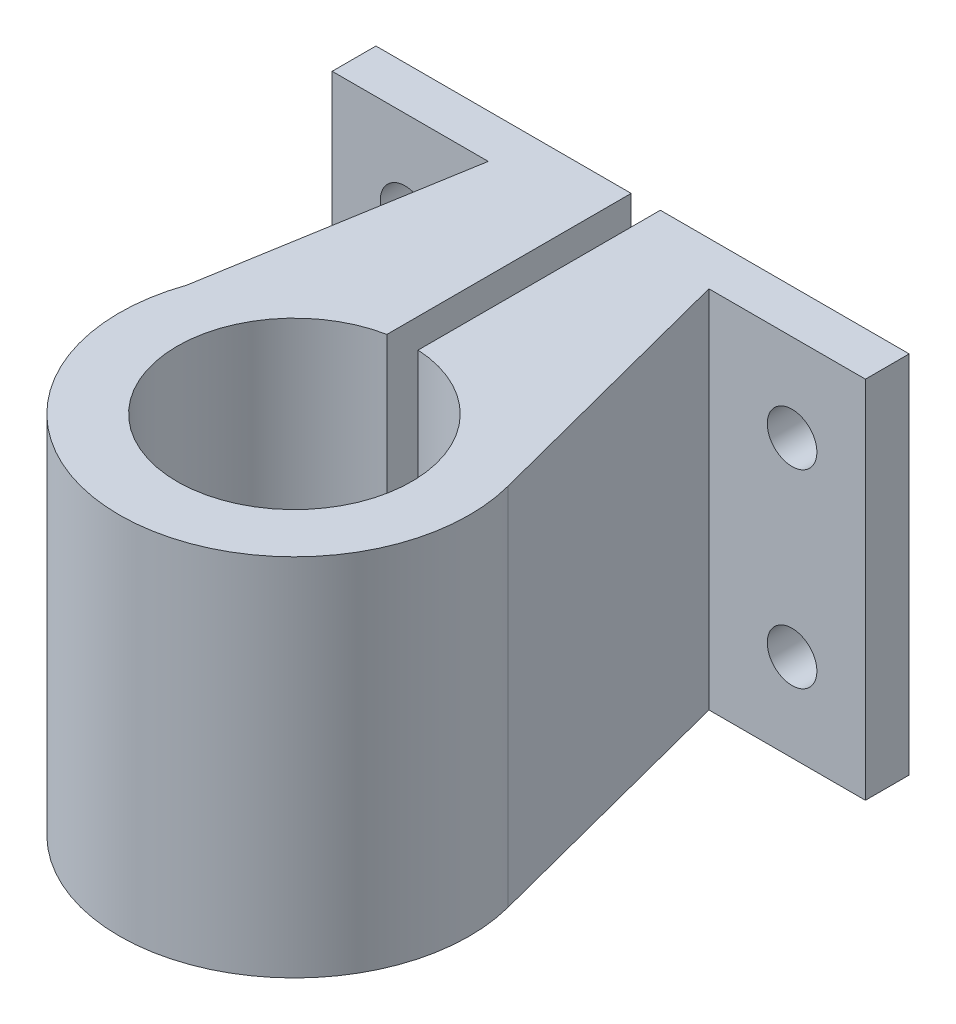
ISO-10303-21;
HEADER;
FILE_DESCRIPTION(('STEP AP214'),'2;1');
FILE_NAME('part.step','',(''),(''),'','','');
FILE_SCHEMA(('AUTOMOTIVE_DESIGN { 1 0 10303 214 1 1 1 1 }'));
ENDSEC;
DATA;
#1=APPLICATION_CONTEXT('core data for automotive mechanical design processes');
#2=APPLICATION_PROTOCOL_DEFINITION('international standard','automotive_design',2000,#1);
#3=PRODUCT_CONTEXT('',#1,'mechanical');
#4=PRODUCT('Part','Part','',(#3));
#5=PRODUCT_RELATED_PRODUCT_CATEGORY('part','',(#4));
#6=PRODUCT_DEFINITION_FORMATION('','',#4);
#7=PRODUCT_DEFINITION_CONTEXT('part definition',#1,'design');
#8=PRODUCT_DEFINITION('design','',#6,#7);
#9=PRODUCT_DEFINITION_SHAPE('','',#8);
#10=(LENGTH_UNIT() NAMED_UNIT(*) SI_UNIT(.MILLI.,.METRE.));
#11=(NAMED_UNIT(*) PLANE_ANGLE_UNIT() SI_UNIT($,.RADIAN.));
#12=(NAMED_UNIT(*) SI_UNIT($,.STERADIAN.) SOLID_ANGLE_UNIT());
#13=UNCERTAINTY_MEASURE_WITH_UNIT(LENGTH_MEASURE(1.E-05),#10,'distance_accuracy_value','');
#14=(GEOMETRIC_REPRESENTATION_CONTEXT(3) GLOBAL_UNCERTAINTY_ASSIGNED_CONTEXT((#13)) GLOBAL_UNIT_ASSIGNED_CONTEXT((#10,
#11,#12)) REPRESENTATION_CONTEXT('',''));
#15=CARTESIAN_POINT('',(0.,0.,0.));
#16=DIRECTION('',(0.,0.,1.));
#17=DIRECTION('',(1.,0.,0.));
#18=AXIS2_PLACEMENT_3D('',#15,#16,#17);
#19=CARTESIAN_POINT('',(-194.02376616138,0.,38.));
#20=DIRECTION('',(1.,0.,0.));
#21=DIRECTION('',(0.,0.,-1.));
#22=AXIS2_PLACEMENT_3D('',#19,#20,#21);
#23=PLANE('',#22);
#24=DIRECTION('',(0.,0.,-1.));
#25=VECTOR('',#24,1.);
#26=CARTESIAN_POINT('',(-194.02376616138,235.923622409626,38.));
#27=LINE('',#26,#25);
#28=CARTESIAN_POINT('',(-194.02376616138,235.923622409626,2.9999999999329));
#29=VERTEX_POINT('',#28);
#30=CARTESIAN_POINT('',(-194.02376616138,235.923622409626,0.));
#31=VERTEX_POINT('',#30);
#32=EDGE_CURVE('E208',#29,#31,#27,.T.);
#33=ORIENTED_EDGE('',*,*,#32,.F.);
#34=DIRECTION('',(0.,1.,0.));
#35=VECTOR('',#34,1.);
#36=CARTESIAN_POINT('',(-194.02376616138,197.923622409626,2.9999999999329));
#37=LINE('',#36,#35);
#38=CARTESIAN_POINT('',(-194.02376616138,210.923622409626,2.9999999999329));
#39=VERTEX_POINT('',#38);
#40=EDGE_CURVE('E259',#39,#29,#37,.T.);
#41=ORIENTED_EDGE('',*,*,#40,.F.);
#42=DIRECTION('',(0.,0.,-1.));
#43=VECTOR('',#42,1.);
#44=CARTESIAN_POINT('',(-194.02376616138,210.923622409626,38.));
#45=LINE('',#44,#43);
#46=CARTESIAN_POINT('',(-194.02376616138,210.923622409626,0.));
#47=VERTEX_POINT('',#46);
#48=EDGE_CURVE('E202',#39,#47,#45,.T.);
#49=ORIENTED_EDGE('',*,*,#48,.T.);
#50=DIRECTION('',(0.,-1.,0.));
#51=VECTOR('',#50,1.);
#52=CARTESIAN_POINT('',(-194.02376616138,0.,0.));
#53=LINE('',#52,#51);
#54=EDGE_CURVE('E196',#31,#47,#53,.T.);
#55=ORIENTED_EDGE('',*,*,#54,.F.);
#56=EDGE_LOOP('',(#33,#41,#49,#55));
#57=FACE_BOUND('',#56,.T.);
#58=ADVANCED_FACE('F72',(#57),#23,.T.);
#59=CARTESIAN_POINT('',(0.,235.923622409626,38.));
#60=DIRECTION('',(0.,1.,0.));
#61=DIRECTION('',(0.,0.,1.));
#62=AXIS2_PLACEMENT_3D('',#59,#60,#61);
#63=PLANE('',#62);
#64=CARTESIAN_POINT('',(-211.531114438714,235.923622409626,24.6300000000886));
#65=DIRECTION('',(0.,1.,0.));
#66=DIRECTION('',(0.,0.,1.));
#67=AXIS2_PLACEMENT_3D('',#64,#65,#66);
#68=CIRCLE('',#67,8.03826441037711);
#69=CARTESIAN_POINT('',(-213.078407845974,235.923622409626,16.7420612425307));
#70=VERTEX_POINT('',#69);
#71=CARTESIAN_POINT('',(-211.078407845971,235.923622409626,16.6044936938159));
#72=VERTEX_POINT('',#71);
#73=EDGE_CURVE('E184',#70,#72,#68,.T.);
#74=ORIENTED_EDGE('',*,*,#73,.F.);
#75=DIRECTION('',(1.06101441971057E-13,0.,-1.));
#76=VECTOR('',#75,1.);
#77=CARTESIAN_POINT('',(-213.078407845972,235.923622409626,-2.26079263253546E-11));
#78=LINE('',#77,#76);
#79=CARTESIAN_POINT('',(-213.078407845973,235.923622409626,0.));
#80=VERTEX_POINT('',#79);
#81=EDGE_CURVE('E167',#70,#80,#78,.T.);
#82=ORIENTED_EDGE('',*,*,#81,.T.);
#83=DIRECTION('',(1.,0.,0.));
#84=VECTOR('',#83,1.);
#85=CARTESIAN_POINT('',(0.,235.923622409626,0.));
#86=LINE('',#85,#84);
#87=CARTESIAN_POINT('',(-230.573766162715,235.923622409626,0.));
#88=VERTEX_POINT('',#87);
#89=EDGE_CURVE('E182',#88,#80,#86,.T.);
#90=ORIENTED_EDGE('',*,*,#89,.F.);
#91=DIRECTION('',(0.,0.,-1.));
#92=VECTOR('',#91,1.);
#93=CARTESIAN_POINT('',(-230.573766162715,235.923622409626,38.));
#94=LINE('',#93,#92);
#95=CARTESIAN_POINT('',(-230.573766162715,235.923622409626,3.));
#96=VERTEX_POINT('',#95);
#97=EDGE_CURVE('E206',#96,#88,#94,.T.);
#98=ORIENTED_EDGE('',*,*,#97,.F.);
#99=DIRECTION('',(1.,0.,0.));
#100=VECTOR('',#99,1.);
#101=CARTESIAN_POINT('',(0.,235.923622409626,3.));
#102=LINE('',#101,#100);
#103=CARTESIAN_POINT('',(-219.873766162724,235.923622409626,3.));
#104=VERTEX_POINT('',#103);
#105=EDGE_CURVE('E244',#96,#104,#102,.T.);
#106=ORIENTED_EDGE('',*,*,#105,.T.);
#107=DIRECTION('',(-0.166720335133998,0.,0.986004224054242));
#108=VECTOR('',#107,1.);
#109=CARTESIAN_POINT('',(-213.269066620411,235.923622409626,-36.0609918226008));
#110=LINE('',#109,#108);
#111=CARTESIAN_POINT('',(-222.864018355181,235.923622409626,20.6847130878201));
#112=VERTEX_POINT('',#111);
#113=EDGE_CURVE('E241',#104,#112,#110,.T.);
#114=ORIENTED_EDGE('',*,*,#113,.T.);
#115=CARTESIAN_POINT('',(-211.531114438714,235.923622409626,24.6300000000886));
#116=DIRECTION('',(0.,1.,0.));
#117=DIRECTION('',(0.,0.,1.));
#118=AXIS2_PLACEMENT_3D('',#115,#116,#117);
#119=CIRCLE('',#118,12.);
#120=CARTESIAN_POINT('',(-199.916412955826,235.923622409626,21.6135932862324));
#121=VERTEX_POINT('',#120);
#122=EDGE_CURVE('E185',#112,#121,#119,.T.);
#123=ORIENTED_EDGE('',*,*,#122,.T.);
#124=DIRECTION('',(0.251367226154686,0.,0.967891790240675));
#125=VECTOR('',#124,1.);
#126=CARTESIAN_POINT('',(-192.543104692355,235.923622409626,50.0045838075491));
#127=LINE('',#126,#125);
#128=CARTESIAN_POINT('',(-204.750473292245,235.923622409626,2.9999999999329));
#129=VERTEX_POINT('',#128);
#130=EDGE_CURVE('E250',#129,#121,#127,.T.);
#131=ORIENTED_EDGE('',*,*,#130,.F.);
#132=DIRECTION('',(1.,0.,0.));
#133=VECTOR('',#132,1.);
#134=CARTESIAN_POINT('',(0.,235.923622409626,2.9999999999329));
#135=LINE('',#134,#133);
#136=EDGE_CURVE('E247',#129,#29,#135,.T.);
#137=ORIENTED_EDGE('',*,*,#136,.T.);
#138=ORIENTED_EDGE('',*,*,#32,.T.);
#139=CARTESIAN_POINT('',(-211.078407845972,235.923622409626,0.));
#140=VERTEX_POINT('',#139);
#141=EDGE_CURVE('E191',#140,#31,#86,.T.);
#142=ORIENTED_EDGE('',*,*,#141,.F.);
#143=DIRECTION('',(0.,0.,-1.));
#144=VECTOR('',#143,1.);
#145=CARTESIAN_POINT('',(-211.078407845972,235.923622409626,6.70381485510578E-12));
#146=LINE('',#145,#144);
#147=EDGE_CURVE('E97',#72,#140,#146,.T.);
#148=ORIENTED_EDGE('',*,*,#147,.F.);
#149=EDGE_LOOP('',(#74,#82,#90,#98,#106,#114,#123,#131,#137,#138,#142,#148));
#150=FACE_BOUND('',#149,.T.);
#151=ADVANCED_FACE('F180',(#150),#63,.T.);
#152=CARTESIAN_POINT('',(-230.573766162715,0.,38.));
#153=DIRECTION('',(1.,0.,0.));
#154=DIRECTION('',(0.,0.,-1.));
#155=AXIS2_PLACEMENT_3D('',#152,#153,#154);
#156=PLANE('',#155);
#157=DIRECTION('',(0.,1.,0.));
#158=VECTOR('',#157,1.);
#159=CARTESIAN_POINT('',(-230.573766162715,197.923622409626,3.));
#160=LINE('',#159,#158);
#161=CARTESIAN_POINT('',(-230.573766162715,210.923622409626,3.));
#162=VERTEX_POINT('',#161);
#163=EDGE_CURVE('E261',#162,#96,#160,.T.);
#164=ORIENTED_EDGE('',*,*,#163,.T.);
#165=ORIENTED_EDGE('',*,*,#97,.T.);
#166=DIRECTION('',(0.,-1.,0.));
#167=VECTOR('',#166,1.);
#168=CARTESIAN_POINT('',(-230.573766162715,0.,0.));
#169=LINE('',#168,#167);
#170=CARTESIAN_POINT('',(-230.573766162715,210.923622409626,0.));
#171=VERTEX_POINT('',#170);
#172=EDGE_CURVE('E190',#88,#171,#169,.T.);
#173=ORIENTED_EDGE('',*,*,#172,.T.);
#174=DIRECTION('',(0.,0.,-1.));
#175=VECTOR('',#174,1.);
#176=CARTESIAN_POINT('',(-230.573766162715,210.923622409626,38.));
#177=LINE('',#176,#175);
#178=EDGE_CURVE('E204',#162,#171,#177,.T.);
#179=ORIENTED_EDGE('',*,*,#178,.F.);
#180=EDGE_LOOP('',(#164,#165,#173,#179));
#181=FACE_BOUND('',#180,.T.);
#182=ADVANCED_FACE('F318',(#181),#156,.F.);
#183=CARTESIAN_POINT('',(-225.573766162715,216.923622409632,38.));
#184=DIRECTION('',(0.,0.,-1.));
#185=DIRECTION('',(-1.,0.,0.));
#186=AXIS2_PLACEMENT_3D('',#183,#184,#185);
#187=CYLINDRICAL_SURFACE('',#186,1.69999999999999);
#188=CARTESIAN_POINT('',(-225.573766162715,216.923622409632,0.));
#189=DIRECTION('',(0.,0.,1.));
#190=DIRECTION('',(1.,0.,0.));
#191=AXIS2_PLACEMENT_3D('',#188,#189,#190);
#192=CIRCLE('',#191,1.69999999999999);
#193=CARTESIAN_POINT('',(-223.873766162715,216.923622409632,0.));
#194=VERTEX_POINT('',#193);
#195=EDGE_CURVE('E277',#194,#194,#192,.T.);
#196=ORIENTED_EDGE('',*,*,#195,.F.);
#197=EDGE_LOOP('',(#196));
#198=FACE_BOUND('',#197,.T.);
#199=CARTESIAN_POINT('',(-225.573766162715,216.923622409632,3.));
#200=DIRECTION('',(0.,0.,1.));
#201=DIRECTION('',(1.,0.,0.));
#202=AXIS2_PLACEMENT_3D('',#199,#200,#201);
#203=CIRCLE('',#202,1.69999999999999);
#204=CARTESIAN_POINT('',(-223.873766162715,216.923622409632,3.));
#205=VERTEX_POINT('',#204);
#206=EDGE_CURVE('E272',#205,#205,#203,.T.);
#207=ORIENTED_EDGE('',*,*,#206,.T.);
#208=EDGE_LOOP('',(#207));
#209=FACE_BOUND('',#208,.T.);
#210=ADVANCED_FACE('F340',(#198,#209),#187,.F.);
#211=CARTESIAN_POINT('',(-225.573766162715,229.923622409632,38.));
#212=DIRECTION('',(0.,0.,-1.));
#213=DIRECTION('',(-1.,0.,0.));
#214=AXIS2_PLACEMENT_3D('',#211,#212,#213);
#215=CYLINDRICAL_SURFACE('',#214,1.69999999999999);
#216=CARTESIAN_POINT('',(-225.573766162715,229.923622409632,0.));
#217=DIRECTION('',(0.,0.,1.));
#218=DIRECTION('',(1.,0.,0.));
#219=AXIS2_PLACEMENT_3D('',#216,#217,#218);
#220=CIRCLE('',#219,1.69999999999999);
#221=CARTESIAN_POINT('',(-223.873766162715,229.923622409632,0.));
#222=VERTEX_POINT('',#221);
#223=EDGE_CURVE('E275',#222,#222,#220,.T.);
#224=ORIENTED_EDGE('',*,*,#223,.F.);
#225=EDGE_LOOP('',(#224));
#226=FACE_BOUND('',#225,.T.);
#227=CARTESIAN_POINT('',(-225.573766162715,229.923622409632,3.));
#228=DIRECTION('',(0.,0.,1.));
#229=DIRECTION('',(1.,0.,0.));
#230=AXIS2_PLACEMENT_3D('',#227,#228,#229);
#231=CIRCLE('',#230,1.69999999999999);
#232=CARTESIAN_POINT('',(-223.873766162715,229.923622409632,3.));
#233=VERTEX_POINT('',#232);
#234=EDGE_CURVE('E269',#233,#233,#231,.T.);
#235=ORIENTED_EDGE('',*,*,#234,.T.);
#236=EDGE_LOOP('',(#235));
#237=FACE_BOUND('',#236,.T.);
#238=ADVANCED_FACE('F74',(#226,#237),#215,.F.);
#239=CARTESIAN_POINT('',(0.,210.923622409626,38.));
#240=DIRECTION('',(0.,1.,0.));
#241=DIRECTION('',(0.,0.,1.));
#242=AXIS2_PLACEMENT_3D('',#239,#240,#241);
#243=PLANE('',#242);
#244=DIRECTION('',(1.06101441971057E-13,0.,-1.));
#245=VECTOR('',#244,1.);
#246=CARTESIAN_POINT('',(-213.078407845976,210.923622409626,37.9999999999774));
#247=LINE('',#246,#245);
#248=CARTESIAN_POINT('',(-213.078407845974,210.923622409626,16.7420612425307));
#249=VERTEX_POINT('',#248);
#250=CARTESIAN_POINT('',(-213.078407845973,210.923622409626,0.));
#251=VERTEX_POINT('',#250);
#252=EDGE_CURVE('E170',#249,#251,#247,.T.);
#253=ORIENTED_EDGE('',*,*,#252,.F.);
#254=CARTESIAN_POINT('',(-211.531114438714,210.923622409626,24.6300000000886));
#255=DIRECTION('',(0.,1.,0.));
#256=DIRECTION('',(0.,0.,1.));
#257=AXIS2_PLACEMENT_3D('',#254,#255,#256);
#258=CIRCLE('',#257,8.03826441037711);
#259=CARTESIAN_POINT('',(-211.078407845971,210.923622409626,16.6044936938159));
#260=VERTEX_POINT('',#259);
#261=EDGE_CURVE('E12',#249,#260,#258,.T.);
#262=ORIENTED_EDGE('',*,*,#261,.T.);
#263=DIRECTION('',(0.,0.,-1.));
#264=VECTOR('',#263,1.);
#265=CARTESIAN_POINT('',(-211.078407845971,210.923622409626,38.0000000000067));
#266=LINE('',#265,#264);
#267=CARTESIAN_POINT('',(-211.078407845972,210.923622409626,0.));
#268=VERTEX_POINT('',#267);
#269=EDGE_CURVE('E256',#260,#268,#266,.T.);
#270=ORIENTED_EDGE('',*,*,#269,.T.);
#271=DIRECTION('',(1.,0.,0.));
#272=VECTOR('',#271,1.);
#273=CARTESIAN_POINT('',(0.,210.923622409626,0.));
#274=LINE('',#273,#272);
#275=EDGE_CURVE('E193',#268,#47,#274,.T.);
#276=ORIENTED_EDGE('',*,*,#275,.T.);
#277=ORIENTED_EDGE('',*,*,#48,.F.);
#278=DIRECTION('',(1.,0.,0.));
#279=VECTOR('',#278,1.);
#280=CARTESIAN_POINT('',(0.,210.923622409626,2.9999999999329));
#281=LINE('',#280,#279);
#282=CARTESIAN_POINT('',(-204.750473292245,210.923622409626,2.9999999999329));
#283=VERTEX_POINT('',#282);
#284=EDGE_CURVE('E81',#283,#39,#281,.T.);
#285=ORIENTED_EDGE('',*,*,#284,.F.);
#286=DIRECTION('',(0.251367226154687,0.,0.967891790240675));
#287=VECTOR('',#286,1.);
#288=CARTESIAN_POINT('',(-183.297846260188,210.923622409626,85.6035354769304));
#289=LINE('',#288,#287);
#290=CARTESIAN_POINT('',(-199.916412955826,210.923622409626,21.6135932862324));
#291=VERTEX_POINT('',#290);
#292=EDGE_CURVE('E216',#283,#291,#289,.T.);
#293=ORIENTED_EDGE('',*,*,#292,.T.);
#294=CARTESIAN_POINT('',(-211.531114438714,210.923622409626,24.6300000000886));
#295=DIRECTION('',(0.,1.,0.));
#296=DIRECTION('',(0.,0.,1.));
#297=AXIS2_PLACEMENT_3D('',#294,#295,#296);
#298=CIRCLE('',#297,12.);
#299=CARTESIAN_POINT('',(-222.864018355181,210.923622409626,20.6847130878201));
#300=VERTEX_POINT('',#299);
#301=EDGE_CURVE('E214',#300,#291,#298,.T.);
#302=ORIENTED_EDGE('',*,*,#301,.F.);
#303=DIRECTION('',(-0.166720335133998,0.,0.986004224054242));
#304=VECTOR('',#303,1.);
#305=CARTESIAN_POINT('',(-219.515770898169,210.923622409626,0.882772711805833));
#306=LINE('',#305,#304);
#307=CARTESIAN_POINT('',(-219.873766162724,210.923622409626,3.));
#308=VERTEX_POINT('',#307);
#309=EDGE_CURVE('E175',#308,#300,#306,.T.);
#310=ORIENTED_EDGE('',*,*,#309,.F.);
#311=DIRECTION('',(1.,0.,0.));
#312=VECTOR('',#311,1.);
#313=CARTESIAN_POINT('',(0.,210.923622409626,3.));
#314=LINE('',#313,#312);
#315=EDGE_CURVE('E212',#162,#308,#314,.T.);
#316=ORIENTED_EDGE('',*,*,#315,.F.);
#317=ORIENTED_EDGE('',*,*,#178,.T.);
#318=EDGE_CURVE('E200',#171,#251,#274,.T.);
#319=ORIENTED_EDGE('',*,*,#318,.T.);
#320=EDGE_LOOP('',(#253,#262,#270,#276,#277,#285,#293,#302,#310,#316,#317,#319));
#321=FACE_BOUND('',#320,.T.);
#322=ADVANCED_FACE('F294',(#321),#243,.F.);
#323=CARTESIAN_POINT('',(0.,0.,0.));
#324=DIRECTION('',(0.,0.,1.));
#325=DIRECTION('',(1.,0.,0.));
#326=AXIS2_PLACEMENT_3D('',#323,#324,#325);
#327=PLANE('',#326);
#328=ORIENTED_EDGE('',*,*,#223,.T.);
#329=EDGE_LOOP('',(#328));
#330=FACE_BOUND('',#329,.T.);
#331=ORIENTED_EDGE('',*,*,#195,.T.);
#332=EDGE_LOOP('',(#331));
#333=FACE_BOUND('',#332,.T.);
#334=DIRECTION('',(0.,1.,0.));
#335=VECTOR('',#334,1.);
#336=CARTESIAN_POINT('',(-213.078407845972,0.,0.));
#337=LINE('',#336,#335);
#338=EDGE_CURVE('E163',#251,#80,#337,.T.);
#339=ORIENTED_EDGE('',*,*,#338,.F.);
#340=ORIENTED_EDGE('',*,*,#318,.F.);
#341=ORIENTED_EDGE('',*,*,#172,.F.);
#342=ORIENTED_EDGE('',*,*,#89,.T.);
#343=EDGE_LOOP('',(#339,#340,#341,#342));
#344=FACE_BOUND('',#343,.T.);
#345=ADVANCED_FACE('F188',(#330,#333,#344),#327,.F.);
#346=CARTESIAN_POINT('',(-199.050473292504,216.923622409632,0.));
#347=DIRECTION('',(0.,0.,-1.));
#348=DIRECTION('',(-1.,0.,0.));
#349=AXIS2_PLACEMENT_3D('',#346,#347,#348);
#350=CIRCLE('',#349,1.70000000000001);
#351=CARTESIAN_POINT('',(-200.750473292504,216.923622409632,0.));
#352=VERTEX_POINT('',#351);
#353=EDGE_CURVE('E221',#352,#352,#350,.T.);
#354=ORIENTED_EDGE('',*,*,#353,.F.);
#355=EDGE_LOOP('',(#354));
#356=FACE_BOUND('',#355,.T.);
#357=CARTESIAN_POINT('',(-199.050473292504,229.923622409632,0.));
#358=DIRECTION('',(0.,0.,-1.));
#359=DIRECTION('',(-1.,0.,0.));
#360=AXIS2_PLACEMENT_3D('',#357,#358,#359);
#361=CIRCLE('',#360,1.70000000000001);
#362=CARTESIAN_POINT('',(-200.750473292504,229.923622409632,0.));
#363=VERTEX_POINT('',#362);
#364=EDGE_CURVE('E227',#363,#363,#361,.T.);
#365=ORIENTED_EDGE('',*,*,#364,.F.);
#366=EDGE_LOOP('',(#365));
#367=FACE_BOUND('',#366,.T.);
#368=ORIENTED_EDGE('',*,*,#275,.F.);
#369=DIRECTION('',(0.,1.,0.));
#370=VECTOR('',#369,1.);
#371=CARTESIAN_POINT('',(-211.078407845972,0.,0.));
#372=LINE('',#371,#370);
#373=EDGE_CURVE('E176',#268,#140,#372,.T.);
#374=ORIENTED_EDGE('',*,*,#373,.T.);
#375=ORIENTED_EDGE('',*,*,#141,.T.);
#376=ORIENTED_EDGE('',*,*,#54,.T.);
#377=EDGE_LOOP('',(#368,#374,#375,#376));
#378=FACE_BOUND('',#377,.T.);
#379=ADVANCED_FACE('F285',(#356,#367,#378),#327,.F.);
#380=CARTESIAN_POINT('',(-211.531114438714,197.923622409626,24.6300000000886));
#381=DIRECTION('',(0.,1.,0.));
#382=DIRECTION('',(0.,0.,1.));
#383=AXIS2_PLACEMENT_3D('',#380,#381,#382);
#384=CYLINDRICAL_SURFACE('',#383,8.03826441037711);
#385=DIRECTION('',(0.,1.,0.));
#386=VECTOR('',#385,1.);
#387=CARTESIAN_POINT('',(-213.078407845974,197.923622409626,16.7420612425307));
#388=LINE('',#387,#386);
#389=EDGE_CURVE('E234',#249,#70,#388,.T.);
#390=ORIENTED_EDGE('',*,*,#389,.T.);
#391=ORIENTED_EDGE('',*,*,#73,.T.);
#392=DIRECTION('',(0.,1.,0.));
#393=VECTOR('',#392,1.);
#394=CARTESIAN_POINT('',(-211.078407845971,197.923622409626,16.6044936938159));
#395=LINE('',#394,#393);
#396=EDGE_CURVE('E225',#260,#72,#395,.T.);
#397=ORIENTED_EDGE('',*,*,#396,.F.);
#398=ORIENTED_EDGE('',*,*,#261,.F.);
#399=EDGE_LOOP('',(#390,#391,#397,#398));
#400=FACE_BOUND('',#399,.T.);
#401=ADVANCED_FACE('F298',(#400),#384,.F.);
#402=CARTESIAN_POINT('',(-213.078407845972,197.923622409626,-2.26079263253546E-11));
#403=DIRECTION('',(1.,0.,1.06101441971057E-13));
#404=DIRECTION('',(1.06101441971057E-13,0.,-1.));
#405=AXIS2_PLACEMENT_3D('',#402,#403,#404);
#406=PLANE('',#405);
#407=ORIENTED_EDGE('',*,*,#252,.T.);
#408=ORIENTED_EDGE('',*,*,#338,.T.);
#409=ORIENTED_EDGE('',*,*,#81,.F.);
#410=ORIENTED_EDGE('',*,*,#389,.F.);
#411=EDGE_LOOP('',(#407,#408,#409,#410));
#412=FACE_BOUND('',#411,.T.);
#413=ADVANCED_FACE('F165',(#412),#406,.T.);
#414=CARTESIAN_POINT('',(-211.078407845972,197.923622409626,6.70381485510578E-12));
#415=DIRECTION('',(1.,0.,0.));
#416=DIRECTION('',(0.,0.,-1.));
#417=AXIS2_PLACEMENT_3D('',#414,#415,#416);
#418=PLANE('',#417);
#419=ORIENTED_EDGE('',*,*,#396,.T.);
#420=ORIENTED_EDGE('',*,*,#147,.T.);
#421=ORIENTED_EDGE('',*,*,#373,.F.);
#422=ORIENTED_EDGE('',*,*,#269,.F.);
#423=EDGE_LOOP('',(#419,#420,#421,#422));
#424=FACE_BOUND('',#423,.T.);
#425=ADVANCED_FACE('F296',(#424),#418,.F.);
#426=CARTESIAN_POINT('',(-211.531114438714,197.923622409626,24.6300000000886));
#427=DIRECTION('',(0.,1.,0.));
#428=DIRECTION('',(0.,0.,1.));
#429=AXIS2_PLACEMENT_3D('',#426,#427,#428);
#430=CYLINDRICAL_SURFACE('',#429,12.);
#431=ORIENTED_EDGE('',*,*,#301,.T.);
#432=DIRECTION('',(0.,1.,0.));
#433=VECTOR('',#432,1.);
#434=CARTESIAN_POINT('',(-199.916412955826,197.923622409626,21.6135932862324));
#435=LINE('',#434,#433);
#436=EDGE_CURVE('E254',#291,#121,#435,.T.);
#437=ORIENTED_EDGE('',*,*,#436,.T.);
#438=ORIENTED_EDGE('',*,*,#122,.F.);
#439=DIRECTION('',(0.,1.,0.));
#440=VECTOR('',#439,1.);
#441=CARTESIAN_POINT('',(-222.864018355181,197.923622409626,20.6847130878201));
#442=LINE('',#441,#440);
#443=EDGE_CURVE('E253',#300,#112,#442,.T.);
#444=ORIENTED_EDGE('',*,*,#443,.F.);
#445=EDGE_LOOP('',(#431,#437,#438,#444));
#446=FACE_BOUND('',#445,.T.);
#447=ADVANCED_FACE('F311',(#446),#430,.T.);
#448=CARTESIAN_POINT('',(-192.543104692355,197.923622409626,50.0045838075491));
#449=DIRECTION('',(-0.967891790240675,0.,0.251367226154687));
#450=DIRECTION('',(0.251367226154687,0.,0.967891790240675));
#451=AXIS2_PLACEMENT_3D('',#448,#449,#450);
#452=PLANE('',#451);
#453=DIRECTION('',(0.,1.,0.));
#454=VECTOR('',#453,1.);
#455=CARTESIAN_POINT('',(-204.750473292245,197.923622409626,2.9999999999329));
#456=LINE('',#455,#454);
#457=EDGE_CURVE('E257',#283,#129,#456,.T.);
#458=ORIENTED_EDGE('',*,*,#457,.T.);
#459=ORIENTED_EDGE('',*,*,#130,.T.);
#460=ORIENTED_EDGE('',*,*,#436,.F.);
#461=ORIENTED_EDGE('',*,*,#292,.F.);
#462=EDGE_LOOP('',(#458,#459,#460,#461));
#463=FACE_BOUND('',#462,.T.);
#464=ADVANCED_FACE('F308',(#463),#452,.F.);
#465=CARTESIAN_POINT('',(0.,197.923622409626,2.9999999999329));
#466=DIRECTION('',(0.,0.,1.));
#467=DIRECTION('',(1.,0.,0.));
#468=AXIS2_PLACEMENT_3D('',#465,#466,#467);
#469=PLANE('',#468);
#470=CARTESIAN_POINT('',(-199.050473292504,216.923622409632,2.9999999999329));
#471=DIRECTION('',(0.,0.,1.));
#472=DIRECTION('',(1.,0.,0.));
#473=AXIS2_PLACEMENT_3D('',#470,#471,#472);
#474=CIRCLE('',#473,1.70000000000001);
#475=CARTESIAN_POINT('',(-200.750473292504,216.923622409632,2.9999999999329));
#476=VERTEX_POINT('',#475);
#477=EDGE_CURVE('E76',#476,#476,#474,.T.);
#478=ORIENTED_EDGE('',*,*,#477,.F.);
#479=EDGE_LOOP('',(#478));
#480=FACE_BOUND('',#479,.T.);
#481=CARTESIAN_POINT('',(-199.050473292504,229.923622409632,2.9999999999329));
#482=DIRECTION('',(0.,0.,1.));
#483=DIRECTION('',(1.,0.,0.));
#484=AXIS2_PLACEMENT_3D('',#481,#482,#483);
#485=CIRCLE('',#484,1.70000000000001);
#486=CARTESIAN_POINT('',(-200.750473292504,229.923622409632,2.9999999999329));
#487=VERTEX_POINT('',#486);
#488=EDGE_CURVE('E219',#487,#487,#485,.T.);
#489=ORIENTED_EDGE('',*,*,#488,.F.);
#490=EDGE_LOOP('',(#489));
#491=FACE_BOUND('',#490,.T.);
#492=ORIENTED_EDGE('',*,*,#284,.T.);
#493=ORIENTED_EDGE('',*,*,#40,.T.);
#494=ORIENTED_EDGE('',*,*,#136,.F.);
#495=ORIENTED_EDGE('',*,*,#457,.F.);
#496=EDGE_LOOP('',(#492,#493,#494,#495));
#497=FACE_BOUND('',#496,.T.);
#498=ADVANCED_FACE('F303',(#480,#491,#497),#469,.T.);
#499=CARTESIAN_POINT('',(0.,197.923622409626,3.));
#500=DIRECTION('',(0.,0.,1.));
#501=DIRECTION('',(1.,0.,0.));
#502=AXIS2_PLACEMENT_3D('',#499,#500,#501);
#503=PLANE('',#502);
#504=ORIENTED_EDGE('',*,*,#206,.F.);
#505=EDGE_LOOP('',(#504));
#506=FACE_BOUND('',#505,.T.);
#507=ORIENTED_EDGE('',*,*,#234,.F.);
#508=EDGE_LOOP('',(#507));
#509=FACE_BOUND('',#508,.T.);
#510=ORIENTED_EDGE('',*,*,#315,.T.);
#511=DIRECTION('',(0.,1.,0.));
#512=VECTOR('',#511,1.);
#513=CARTESIAN_POINT('',(-219.873766162724,197.923622409626,3.));
#514=LINE('',#513,#512);
#515=EDGE_CURVE('E89',#308,#104,#514,.T.);
#516=ORIENTED_EDGE('',*,*,#515,.T.);
#517=ORIENTED_EDGE('',*,*,#105,.F.);
#518=ORIENTED_EDGE('',*,*,#163,.F.);
#519=EDGE_LOOP('',(#510,#516,#517,#518));
#520=FACE_BOUND('',#519,.T.);
#521=ADVANCED_FACE('F319',(#506,#509,#520),#503,.T.);
#522=CARTESIAN_POINT('',(-213.269066620411,197.923622409626,-36.0609918226008));
#523=DIRECTION('',(-0.986004224054242,0.,-0.166720335133998));
#524=DIRECTION('',(-0.166720335133998,0.,0.986004224054242));
#525=AXIS2_PLACEMENT_3D('',#522,#523,#524);
#526=PLANE('',#525);
#527=ORIENTED_EDGE('',*,*,#309,.T.);
#528=ORIENTED_EDGE('',*,*,#443,.T.);
#529=ORIENTED_EDGE('',*,*,#113,.F.);
#530=ORIENTED_EDGE('',*,*,#515,.F.);
#531=EDGE_LOOP('',(#527,#528,#529,#530));
#532=FACE_BOUND('',#531,.T.);
#533=ADVANCED_FACE('F313',(#532),#526,.T.);
#534=CARTESIAN_POINT('',(-199.050473292504,229.923622409632,8.99999999999998));
#535=DIRECTION('',(0.,0.,-1.));
#536=DIRECTION('',(-1.,0.,0.));
#537=AXIS2_PLACEMENT_3D('',#534,#535,#536);
#538=CYLINDRICAL_SURFACE('',#537,1.70000000000001);
#539=CARTESIAN_POINT('',(-200.750473292504,229.923622409632,2.9999999999329));
#540=CARTESIAN_POINT('',(-200.750473292504,229.923622409632,2.9687499999336));
#541=CARTESIAN_POINT('',(-200.750473292504,229.923622409632,2.9374999999343));
#542=CARTESIAN_POINT('',(-200.750473292504,229.923622409632,2.87499999993569));
#543=CARTESIAN_POINT('',(-200.750473292504,229.923622409632,2.84374999993639));
#544=CARTESIAN_POINT('',(-200.750473292504,229.923622409632,2.78124999993779));
#545=CARTESIAN_POINT('',(-200.750473292504,229.923622409632,2.74999999993849));
#546=CARTESIAN_POINT('',(-200.750473292504,229.923622409632,2.68749999993989));
#547=CARTESIAN_POINT('',(-200.750473292504,229.923622409632,2.65624999994059));
#548=CARTESIAN_POINT('',(-200.750473292504,229.923622409632,2.59374999994199));
#549=CARTESIAN_POINT('',(-200.750473292504,229.923622409632,2.56249999994268));
#550=CARTESIAN_POINT('',(-200.750473292504,229.923622409632,2.49999999994408));
#551=CARTESIAN_POINT('',(-200.750473292504,229.923622409632,2.46874999994478));
#552=CARTESIAN_POINT('',(-200.750473292504,229.923622409632,2.40624999994618));
#553=CARTESIAN_POINT('',(-200.750473292504,229.923622409632,2.37499999994688));
#554=CARTESIAN_POINT('',(-200.750473292504,229.923622409632,2.31249999994828));
#555=CARTESIAN_POINT('',(-200.750473292504,229.923622409632,2.28124999994898));
#556=CARTESIAN_POINT('',(-200.750473292504,229.923622409632,2.21874999995037));
#557=CARTESIAN_POINT('',(-200.750473292504,229.923622409632,2.18749999995107));
#558=CARTESIAN_POINT('',(-200.750473292504,229.923622409632,2.12499999995247));
#559=CARTESIAN_POINT('',(-200.750473292504,229.923622409632,2.09374999995317));
#560=CARTESIAN_POINT('',(-200.750473292504,229.923622409632,2.03124999995457));
#561=CARTESIAN_POINT('',(-200.750473292504,229.923622409632,1.99999999995527));
#562=CARTESIAN_POINT('',(-200.750473292504,229.923622409632,1.93749999995666));
#563=CARTESIAN_POINT('',(-200.750473292504,229.923622409632,1.90624999995736));
#564=CARTESIAN_POINT('',(-200.750473292504,229.923622409632,1.84374999995876));
#565=CARTESIAN_POINT('',(-200.750473292504,229.923622409632,1.81249999995946));
#566=CARTESIAN_POINT('',(-200.750473292504,229.923622409632,1.74999999996086));
#567=CARTESIAN_POINT('',(-200.750473292504,229.923622409632,1.71874999996156));
#568=CARTESIAN_POINT('',(-200.750473292504,229.923622409632,1.65624999996295));
#569=CARTESIAN_POINT('',(-200.750473292504,229.923622409632,1.62499999996365));
#570=CARTESIAN_POINT('',(-200.750473292504,229.923622409632,1.56249999996505));
#571=CARTESIAN_POINT('',(-200.750473292504,229.923622409632,1.53124999996575));
#572=CARTESIAN_POINT('',(-200.750473292504,229.923622409632,1.46874999996715));
#573=CARTESIAN_POINT('',(-200.750473292504,229.923622409632,1.43749999996785));
#574=CARTESIAN_POINT('',(-200.750473292504,229.923622409632,1.37499999996925));
#575=CARTESIAN_POINT('',(-200.750473292504,229.923622409632,1.34374999996994));
#576=CARTESIAN_POINT('',(-200.750473292504,229.923622409632,1.28124999997134));
#577=CARTESIAN_POINT('',(-200.750473292504,229.923622409632,1.24999999997204));
#578=CARTESIAN_POINT('',(-200.750473292504,229.923622409632,1.18749999997344));
#579=CARTESIAN_POINT('',(-200.750473292504,229.923622409632,1.15624999997414));
#580=CARTESIAN_POINT('',(-200.750473292504,229.923622409632,1.09374999997554));
#581=CARTESIAN_POINT('',(-200.750473292504,229.923622409632,1.06249999997624));
#582=CARTESIAN_POINT('',(-200.750473292504,229.923622409632,0.999999999977633));
#583=CARTESIAN_POINT('',(-200.750473292504,229.923622409632,0.968749999978332));
#584=CARTESIAN_POINT('',(-200.750473292504,229.923622409632,0.906249999979731));
#585=CARTESIAN_POINT('',(-200.750473292504,229.923622409632,0.87499999998043));
#586=CARTESIAN_POINT('',(-200.750473292504,229.923622409632,0.812499999981828));
#587=CARTESIAN_POINT('',(-200.750473292504,229.923622409632,0.781249999982527));
#588=CARTESIAN_POINT('',(-200.750473292504,229.923622409632,0.718749999983924));
#589=CARTESIAN_POINT('',(-200.750473292504,229.923622409632,0.687499999984623));
#590=CARTESIAN_POINT('',(-200.750473292504,229.923622409632,0.62499999998602));
#591=CARTESIAN_POINT('',(-200.750473292504,229.923622409632,0.59374999998672));
#592=CARTESIAN_POINT('',(-200.750473292504,229.923622409632,0.531249999988118));
#593=CARTESIAN_POINT('',(-200.750473292504,229.923622409632,0.499999999988817));
#594=CARTESIAN_POINT('',(-200.750473292504,229.923622409632,0.437499999990215));
#595=CARTESIAN_POINT('',(-200.750473292504,229.923622409632,0.406249999990914));
#596=CARTESIAN_POINT('',(-200.750473292504,229.923622409632,0.343749999992312));
#597=CARTESIAN_POINT('',(-200.750473292504,229.923622409632,0.312499999993011));
#598=CARTESIAN_POINT('',(-200.750473292504,229.923622409632,0.249999999994409));
#599=CARTESIAN_POINT('',(-200.750473292504,229.923622409632,0.218749999995107));
#600=CARTESIAN_POINT('',(-200.750473292504,229.923622409632,0.156249999996505));
#601=CARTESIAN_POINT('',(-200.750473292504,229.923622409632,0.124999999997204));
#602=CARTESIAN_POINT('',(-200.750473292504,229.923622409632,0.0624999999986019));
#603=CARTESIAN_POINT('',(-200.750473292504,229.923622409632,0.0312499999993009));
#604=CARTESIAN_POINT('',(-200.750473292504,229.923622409632,0.));
#605=B_SPLINE_CURVE_WITH_KNOTS('',3,(#539,#540,#541,#542,#543,#544,#545,#546,#547,#548,#549,
#550,#551,#552,#553,#554,#555,#556,#557,#558,#559,#560,#561,#562,#563,#564,#565,#566,#567,#568,
#569,#570,#571,#572,#573,#574,#575,#576,#577,#578,#579,#580,#581,#582,#583,#584,#585,#586,#587,
#588,#589,#590,#591,#592,#593,#594,#595,#596,#597,#598,#599,#600,#601,#602,#603,#604),
.UNSPECIFIED.,.F.,.F.,(4,2,2,2,2,2,2,2,2,2,2,2,2,2,2,2,2,2,2,2,2,2,2,2,2,2,2,2,2,2,2,2,4),(0.,
0.0937499999979028,0.187499999995806,0.281249999993709,0.374999999991613,0.468749999989516,
0.562499999987419,0.656249999985322,0.749999999983225,0.843749999981128,0.937499999979031,
1.03124999997693,1.12499999997484,1.21874999997274,1.31249999997064,1.40624999996855,
1.49999999996645,1.59374999996435,1.68749999996226,1.78124999996016,1.87499999995806,
1.96874999995597,2.06249999995387,2.15624999995177,2.24999999994967,2.34374999994758,
2.43749999994548,2.53124999994338,2.62499999994129,2.71874999993919,2.81249999993709,
2.906249999935,2.9999999999329),.UNSPECIFIED.);
#606=EDGE_CURVE('BSEAM327',#487,#363,#605,.T.);
#607=ORIENTED_EDGE('',*,*,#488,.T.);
#608=ORIENTED_EDGE('',*,*,#364,.T.);
#609=ORIENTED_EDGE('',*,*,#606,.T.);
#610=ORIENTED_EDGE('',*,*,#606,.F.);
#611=EDGE_LOOP('',(#607,#609,#608,#610));
#612=FACE_BOUND('',#611,.T.);
#613=ADVANCED_FACE('F327',(#612),#538,.F.);
#614=CARTESIAN_POINT('',(-199.050473292504,216.923622409632,8.99999999999998));
#615=DIRECTION('',(0.,0.,-1.));
#616=DIRECTION('',(-1.,0.,0.));
#617=AXIS2_PLACEMENT_3D('',#614,#615,#616);
#618=CYLINDRICAL_SURFACE('',#617,1.70000000000001);
#619=CARTESIAN_POINT('',(-200.750473292504,216.923622409632,2.9999999999329));
#620=CARTESIAN_POINT('',(-200.750473292504,216.923622409632,2.9687499999336));
#621=CARTESIAN_POINT('',(-200.750473292504,216.923622409632,2.9374999999343));
#622=CARTESIAN_POINT('',(-200.750473292504,216.923622409632,2.87499999993569));
#623=CARTESIAN_POINT('',(-200.750473292504,216.923622409632,2.84374999993639));
#624=CARTESIAN_POINT('',(-200.750473292504,216.923622409632,2.78124999993779));
#625=CARTESIAN_POINT('',(-200.750473292504,216.923622409632,2.74999999993849));
#626=CARTESIAN_POINT('',(-200.750473292504,216.923622409632,2.68749999993989));
#627=CARTESIAN_POINT('',(-200.750473292504,216.923622409632,2.65624999994059));
#628=CARTESIAN_POINT('',(-200.750473292504,216.923622409632,2.59374999994199));
#629=CARTESIAN_POINT('',(-200.750473292504,216.923622409632,2.56249999994268));
#630=CARTESIAN_POINT('',(-200.750473292504,216.923622409632,2.49999999994408));
#631=CARTESIAN_POINT('',(-200.750473292504,216.923622409632,2.46874999994478));
#632=CARTESIAN_POINT('',(-200.750473292504,216.923622409632,2.40624999994618));
#633=CARTESIAN_POINT('',(-200.750473292504,216.923622409632,2.37499999994688));
#634=CARTESIAN_POINT('',(-200.750473292504,216.923622409632,2.31249999994828));
#635=CARTESIAN_POINT('',(-200.750473292504,216.923622409632,2.28124999994898));
#636=CARTESIAN_POINT('',(-200.750473292504,216.923622409632,2.21874999995037));
#637=CARTESIAN_POINT('',(-200.750473292504,216.923622409632,2.18749999995107));
#638=CARTESIAN_POINT('',(-200.750473292504,216.923622409632,2.12499999995247));
#639=CARTESIAN_POINT('',(-200.750473292504,216.923622409632,2.09374999995317));
#640=CARTESIAN_POINT('',(-200.750473292504,216.923622409632,2.03124999995457));
#641=CARTESIAN_POINT('',(-200.750473292504,216.923622409632,1.99999999995527));
#642=CARTESIAN_POINT('',(-200.750473292504,216.923622409632,1.93749999995666));
#643=CARTESIAN_POINT('',(-200.750473292504,216.923622409632,1.90624999995736));
#644=CARTESIAN_POINT('',(-200.750473292504,216.923622409632,1.84374999995876));
#645=CARTESIAN_POINT('',(-200.750473292504,216.923622409632,1.81249999995946));
#646=CARTESIAN_POINT('',(-200.750473292504,216.923622409632,1.74999999996086));
#647=CARTESIAN_POINT('',(-200.750473292504,216.923622409632,1.71874999996156));
#648=CARTESIAN_POINT('',(-200.750473292504,216.923622409632,1.65624999996295));
#649=CARTESIAN_POINT('',(-200.750473292504,216.923622409632,1.62499999996365));
#650=CARTESIAN_POINT('',(-200.750473292504,216.923622409632,1.56249999996505));
#651=CARTESIAN_POINT('',(-200.750473292504,216.923622409632,1.53124999996575));
#652=CARTESIAN_POINT('',(-200.750473292504,216.923622409632,1.46874999996715));
#653=CARTESIAN_POINT('',(-200.750473292504,216.923622409632,1.43749999996785));
#654=CARTESIAN_POINT('',(-200.750473292504,216.923622409632,1.37499999996925));
#655=CARTESIAN_POINT('',(-200.750473292504,216.923622409632,1.34374999996994));
#656=CARTESIAN_POINT('',(-200.750473292504,216.923622409632,1.28124999997134));
#657=CARTESIAN_POINT('',(-200.750473292504,216.923622409632,1.24999999997204));
#658=CARTESIAN_POINT('',(-200.750473292504,216.923622409632,1.18749999997344));
#659=CARTESIAN_POINT('',(-200.750473292504,216.923622409632,1.15624999997414));
#660=CARTESIAN_POINT('',(-200.750473292504,216.923622409632,1.09374999997554));
#661=CARTESIAN_POINT('',(-200.750473292504,216.923622409632,1.06249999997624));
#662=CARTESIAN_POINT('',(-200.750473292504,216.923622409632,0.999999999977633));
#663=CARTESIAN_POINT('',(-200.750473292504,216.923622409632,0.968749999978332));
#664=CARTESIAN_POINT('',(-200.750473292504,216.923622409632,0.906249999979731));
#665=CARTESIAN_POINT('',(-200.750473292504,216.923622409632,0.87499999998043));
#666=CARTESIAN_POINT('',(-200.750473292504,216.923622409632,0.812499999981828));
#667=CARTESIAN_POINT('',(-200.750473292504,216.923622409632,0.781249999982527));
#668=CARTESIAN_POINT('',(-200.750473292504,216.923622409632,0.718749999983924));
#669=CARTESIAN_POINT('',(-200.750473292504,216.923622409632,0.687499999984623));
#670=CARTESIAN_POINT('',(-200.750473292504,216.923622409632,0.62499999998602));
#671=CARTESIAN_POINT('',(-200.750473292504,216.923622409632,0.59374999998672));
#672=CARTESIAN_POINT('',(-200.750473292504,216.923622409632,0.531249999988118));
#673=CARTESIAN_POINT('',(-200.750473292504,216.923622409632,0.499999999988817));
#674=CARTESIAN_POINT('',(-200.750473292504,216.923622409632,0.437499999990215));
#675=CARTESIAN_POINT('',(-200.750473292504,216.923622409632,0.406249999990914));
#676=CARTESIAN_POINT('',(-200.750473292504,216.923622409632,0.343749999992312));
#677=CARTESIAN_POINT('',(-200.750473292504,216.923622409632,0.312499999993011));
#678=CARTESIAN_POINT('',(-200.750473292504,216.923622409632,0.249999999994409));
#679=CARTESIAN_POINT('',(-200.750473292504,216.923622409632,0.218749999995107));
#680=CARTESIAN_POINT('',(-200.750473292504,216.923622409632,0.156249999996505));
#681=CARTESIAN_POINT('',(-200.750473292504,216.923622409632,0.124999999997204));
#682=CARTESIAN_POINT('',(-200.750473292504,216.923622409632,0.0624999999986019));
#683=CARTESIAN_POINT('',(-200.750473292504,216.923622409632,0.0312499999993009));
#684=CARTESIAN_POINT('',(-200.750473292504,216.923622409632,0.));
#685=B_SPLINE_CURVE_WITH_KNOTS('',3,(#619,#620,#621,#622,#623,#624,#625,#626,#627,#628,#629,
#630,#631,#632,#633,#634,#635,#636,#637,#638,#639,#640,#641,#642,#643,#644,#645,#646,#647,#648,
#649,#650,#651,#652,#653,#654,#655,#656,#657,#658,#659,#660,#661,#662,#663,#664,#665,#666,#667,
#668,#669,#670,#671,#672,#673,#674,#675,#676,#677,#678,#679,#680,#681,#682,#683,#684),
.UNSPECIFIED.,.F.,.F.,(4,2,2,2,2,2,2,2,2,2,2,2,2,2,2,2,2,2,2,2,2,2,2,2,2,2,2,2,2,2,2,2,4),(0.,
0.0937499999979028,0.187499999995806,0.281249999993709,0.374999999991613,0.468749999989516,
0.562499999987419,0.656249999985322,0.749999999983225,0.843749999981128,0.937499999979031,
1.03124999997693,1.12499999997484,1.21874999997274,1.31249999997064,1.40624999996855,
1.49999999996645,1.59374999996435,1.68749999996226,1.78124999996016,1.87499999995806,
1.96874999995597,2.06249999995387,2.15624999995177,2.24999999994967,2.34374999994758,
2.43749999994548,2.53124999994338,2.62499999994129,2.71874999993919,2.81249999993709,
2.906249999935,2.9999999999329),.UNSPECIFIED.);
#686=EDGE_CURVE('BSEAM373',#476,#352,#685,.T.);
#687=ORIENTED_EDGE('',*,*,#477,.T.);
#688=ORIENTED_EDGE('',*,*,#353,.T.);
#689=ORIENTED_EDGE('',*,*,#686,.T.);
#690=ORIENTED_EDGE('',*,*,#686,.F.);
#691=EDGE_LOOP('',(#687,#689,#688,#690));
#692=FACE_BOUND('',#691,.T.);
#693=ADVANCED_FACE('F373',(#692),#618,.F.);
#694=CLOSED_SHELL('',(#58,#151,#182,#210,#238,#322,#345,#379,#401,#413,#425,#447,#464,#498,#521,
#533,#613,#693));
#695=MANIFOLD_SOLID_BREP('B2',#694);
#696=ADVANCED_BREP_SHAPE_REPRESENTATION('',(#18,#695),#14);
#697=SHAPE_DEFINITION_REPRESENTATION(#9,#696);
ENDSEC;
END-ISO-10303-21;
